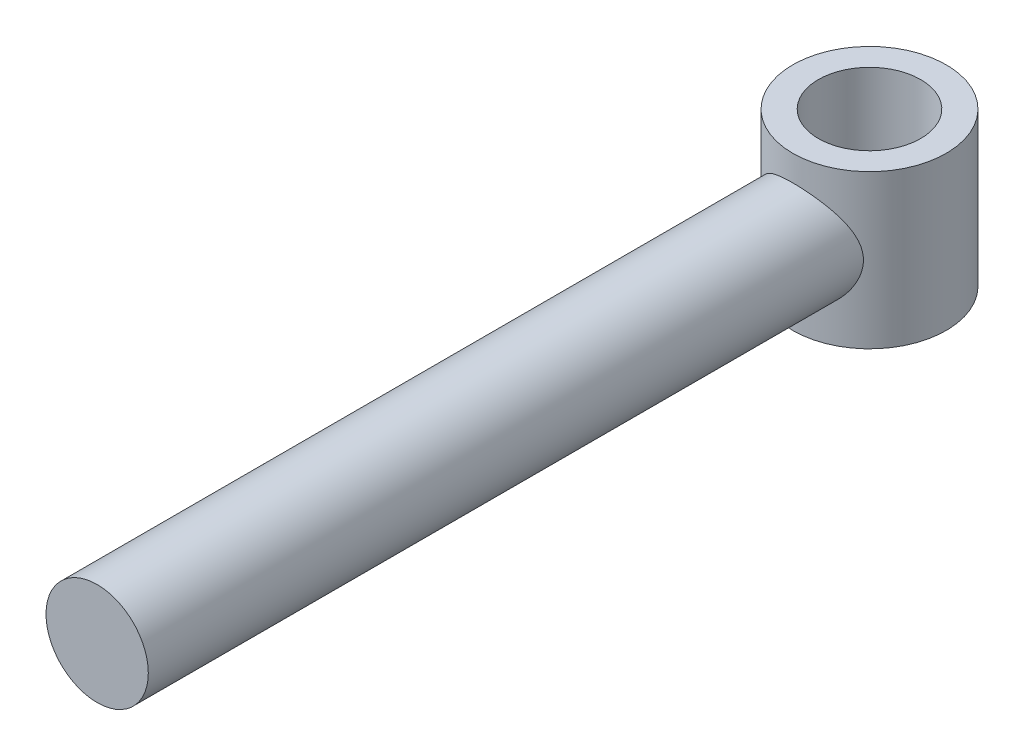
ISO-10303-21;
HEADER;
FILE_DESCRIPTION(('STEP AP214'),'2;1');
FILE_NAME('part.step','',(''),(''),'','','');
FILE_SCHEMA(('AUTOMOTIVE_DESIGN { 1 0 10303 214 1 1 1 1 }'));
ENDSEC;
DATA;
#1=APPLICATION_CONTEXT('core data for automotive mechanical design processes');
#2=APPLICATION_PROTOCOL_DEFINITION('international standard','automotive_design',2000,#1);
#3=PRODUCT_CONTEXT('',#1,'mechanical');
#4=PRODUCT('Part','Part','',(#3));
#5=PRODUCT_RELATED_PRODUCT_CATEGORY('part','',(#4));
#6=PRODUCT_DEFINITION_FORMATION('','',#4);
#7=PRODUCT_DEFINITION_CONTEXT('part definition',#1,'design');
#8=PRODUCT_DEFINITION('design','',#6,#7);
#9=PRODUCT_DEFINITION_SHAPE('','',#8);
#10=(LENGTH_UNIT() NAMED_UNIT(*) SI_UNIT(.MILLI.,.METRE.));
#11=(NAMED_UNIT(*) PLANE_ANGLE_UNIT() SI_UNIT($,.RADIAN.));
#12=(NAMED_UNIT(*) SI_UNIT($,.STERADIAN.) SOLID_ANGLE_UNIT());
#13=UNCERTAINTY_MEASURE_WITH_UNIT(LENGTH_MEASURE(1.E-05),#10,'distance_accuracy_value','');
#14=(GEOMETRIC_REPRESENTATION_CONTEXT(3) GLOBAL_UNCERTAINTY_ASSIGNED_CONTEXT((#13)) GLOBAL_UNIT_ASSIGNED_CONTEXT((#10,
#11,#12)) REPRESENTATION_CONTEXT('',''));
#15=CARTESIAN_POINT('',(0.,0.,0.));
#16=DIRECTION('',(0.,0.,1.));
#17=DIRECTION('',(1.,0.,0.));
#18=AXIS2_PLACEMENT_3D('',#15,#16,#17);
#19=CARTESIAN_POINT('',(0.,0.,177.8));
#20=DIRECTION('',(0.,0.,-1.));
#21=DIRECTION('',(-1.,0.,0.));
#22=AXIS2_PLACEMENT_3D('',#19,#20,#21);
#23=CYLINDRICAL_SURFACE('',#22,12.7);
#24=CARTESIAN_POINT('',(0.,0.,177.8));
#25=DIRECTION('',(0.,0.,1.));
#26=DIRECTION('',(1.,0.,0.));
#27=AXIS2_PLACEMENT_3D('',#24,#25,#26);
#28=CIRCLE('',#27,12.7);
#29=CARTESIAN_POINT('',(12.7,0.,177.8));
#30=VERTEX_POINT('',#29);
#31=EDGE_CURVE('E53',#30,#30,#28,.T.);
#32=ORIENTED_EDGE('',*,*,#31,.F.);
#33=EDGE_LOOP('',(#32));
#34=FACE_BOUND('',#33,.T.);
#35=CARTESIAN_POINT('',(-12.7,0.,0.229031657123601));
#36=CARTESIAN_POINT('',(-12.6999977119747,0.310012704978737,0.22903554777606));
#37=CARTESIAN_POINT('',(-12.6886249705167,0.620057438022824,0.239230920042472));
#38=CARTESIAN_POINT('',(-12.6433817788832,1.23720777302357,0.279501205289839));
#39=CARTESIAN_POINT('',(-12.609507741087,1.54431289836528,0.309579288378912));
#40=CARTESIAN_POINT('',(-12.519912147887,2.15328851686199,0.388197440830072));
#41=CARTESIAN_POINT('',(-12.4641629160762,2.45515187093428,0.43676089547101));
#42=CARTESIAN_POINT('',(-12.3317967460712,3.05124300196507,0.550222778771863));
#43=CARTESIAN_POINT('',(-12.2551691359499,3.34546678950763,0.615129559988746));
#44=CARTESIAN_POINT('',(-12.083048903963,3.92166137776216,0.758026951320603));
#45=CARTESIAN_POINT('',(-11.9877528128264,4.20372535394453,0.835880078864611));
#46=CARTESIAN_POINT('',(-11.7789380708877,4.75754712433804,1.00254171341168));
#47=CARTESIAN_POINT('',(-11.6654206910129,5.0293056357179,1.09134945623495));
#48=CARTESIAN_POINT('',(-11.2988962671107,5.82821568040227,1.37051446855346));
#49=CARTESIAN_POINT('',(-11.0198301654547,6.33928740864035,1.57368892698236));
#50=CARTESIAN_POINT('',(-10.5299962431118,7.10779816654755,1.90668152357742));
#51=CARTESIAN_POINT('',(-10.3400698069987,7.38129256412716,2.03129382602669));
#52=CARTESIAN_POINT('',(-9.93987863185937,7.91196383554938,2.28291041634368));
#53=CARTESIAN_POINT('',(-9.72961251845091,8.16913960477092,2.4099148653847));
#54=CARTESIAN_POINT('',(-9.289288728591,8.66657824457166,2.66358836378729));
#55=CARTESIAN_POINT('',(-9.05921306870562,8.90682537957079,2.79025699845735));
#56=CARTESIAN_POINT('',(-8.58003424358432,9.36930534481374,3.04054332161362));
#57=CARTESIAN_POINT('',(-8.33092976817566,9.59153693247509,3.16416079924473));
#58=CARTESIAN_POINT('',(-7.77692783087647,10.0476907760157,3.42334444597091));
#59=CARTESIAN_POINT('',(-7.46917349471749,10.2786496334743,3.55805040155415));
#60=CARTESIAN_POINT('',(-6.83073663017676,10.7135529764663,3.81657221316838));
#61=CARTESIAN_POINT('',(-6.50005134297316,10.9174942028892,3.94038675477451));
#62=CARTESIAN_POINT('',(-5.81769120391199,11.2958625620811,4.17350649806974));
#63=CARTESIAN_POINT('',(-5.46603423679166,11.4703143700988,4.28282381363));
#64=CARTESIAN_POINT('',(-4.74379195423513,11.7873606897126,4.48370761051776));
#65=CARTESIAN_POINT('',(-4.37321071422009,11.9299620251905,4.57527789354421));
#66=CARTESIAN_POINT('',(-3.65865303784004,12.1667422669219,4.72852747296075));
#67=CARTESIAN_POINT('',(-3.3163524413243,12.2645577373741,4.79240706497086));
#68=CARTESIAN_POINT('',(-2.62195737916231,12.4315244718113,4.90197185224236));
#69=CARTESIAN_POINT('',(-2.26986357588883,12.5006776693897,4.94765827482993));
#70=CARTESIAN_POINT('',(-1.55948915291248,12.609002890342,5.01941306827285));
#71=CARTESIAN_POINT('',(-1.2012154128157,12.6482062973116,5.0455019743679));
#72=CARTESIAN_POINT('',(-0.481748521364579,12.6959771066052,5.07730969810913));
#73=CARTESIAN_POINT('',(-0.120555789135986,12.7045488315364,5.08303138988592));
#74=CARTESIAN_POINT('',(0.545977074000862,12.6919472076019,5.07463259789147));
#75=CARTESIAN_POINT('',(0.85144757538674,12.6751042129758,5.06340069622206));
#76=CARTESIAN_POINT('',(1.45947735526262,12.6195518624076,5.02645107805321));
#77=CARTESIAN_POINT('',(1.76203700441655,12.5808453290467,5.00073523143134));
#78=CARTESIAN_POINT('',(2.36212562431451,12.4821010784272,4.93539554550888));
#79=CARTESIAN_POINT('',(2.65965437619799,12.42206243564,4.89577110276199));
#80=CARTESIAN_POINT('',(3.2477434731375,12.281432269573,4.80347238924742));
#81=CARTESIAN_POINT('',(3.53830351644082,12.200839858044,4.75079755449845));
#82=CARTESIAN_POINT('',(4.10953190541883,12.0204444785481,4.6337334513632));
#83=CARTESIAN_POINT('',(4.39023727015804,11.920725222046,4.56939529420503));
#84=CARTESIAN_POINT('',(4.94178334563123,11.7028517985634,4.43006045772515));
#85=CARTESIAN_POINT('',(5.21262004067534,11.5846902282493,4.35505949909666));
#86=CARTESIAN_POINT('',(5.74314173477802,11.3310529177882,4.19577885725519));
#87=CARTESIAN_POINT('',(6.00282878078201,11.1955803740496,4.11150088740578));
#88=CARTESIAN_POINT('',(6.51024515533807,10.908332869392,3.93506578231165));
#89=CARTESIAN_POINT('',(6.75797307548681,10.7565559950988,3.84290772256836));
#90=CARTESIAN_POINT('',(7.27248710951176,10.4167203555039,3.63964648159054));
#91=CARTESIAN_POINT('',(7.53750156276716,10.2265146173388,3.52764495383651));
#92=CARTESIAN_POINT('',(8.05053952465949,9.82773618044362,3.29761033157287));
#93=CARTESIAN_POINT('',(8.29856176703086,9.61916211554057,3.1795767886972));
#94=CARTESIAN_POINT('',(8.77732290554606,9.18440570712839,2.93955066303762));
#95=CARTESIAN_POINT('',(9.00803680171706,8.95819882063012,2.81755270498106));
#96=CARTESIAN_POINT('',(9.451233824735,8.48930323388696,2.57209367691352));
#97=CARTESIAN_POINT('',(9.66371545060214,8.24661317959879,2.44863248739179));
#98=CARTESIAN_POINT('',(10.1014214617723,7.7065017902318,2.18360590999463));
#99=CARTESIAN_POINT('',(10.3234961380071,7.40643546299729,2.04220811219275));
#100=CARTESIAN_POINT('',(10.741465175483,6.78607681880215,1.76487687037188));
#101=CARTESIAN_POINT('',(10.9373536462383,6.46577997484467,1.62894466060803));
#102=CARTESIAN_POINT('',(11.3012099185556,5.80639550131142,1.36738173239818));
#103=CARTESIAN_POINT('',(11.4692215013225,5.46733847361716,1.24173502068927));
#104=CARTESIAN_POINT('',(11.7759209042205,4.77098924818188,1.0055695053963));
#105=CARTESIAN_POINT('',(11.9146075155383,4.41369629948584,0.895051325496163));
#106=CARTESIAN_POINT('',(12.125337008358,3.78710470148277,0.723248742267917));
#107=CARTESIAN_POINT('',(12.2051062844318,3.52176972555369,0.656912044136649));
#108=CARTESIAN_POINT('',(12.3476139793357,2.98391453695631,0.536812874768645));
#109=CARTESIAN_POINT('',(12.4103632760973,2.71139903634657,0.483042375188796));
#110=CARTESIAN_POINT('',(12.5179737523736,2.16076815510134,0.38994103435114));
#111=CARTESIAN_POINT('',(12.5628572262605,1.88266021155425,0.350592201500896));
#112=CARTESIAN_POINT('',(12.6341332919858,1.32228422222191,0.287750452548324));
#113=CARTESIAN_POINT('',(12.6605258090948,1.04001615962864,0.264257600526421));
#114=CARTESIAN_POINT('',(12.6944193254624,0.472187106069349,0.234039769777274));
#115=CARTESIAN_POINT('',(12.7018365020652,0.186617082960048,0.227389192290143));
#116=CARTESIAN_POINT('',(12.6973946024109,-0.38425134471535,0.231361825244995));
#117=CARTESIAN_POINT('',(12.6855354799346,-0.669549748628539,0.241985077104839));
#118=CARTESIAN_POINT('',(12.6427517573922,-1.23776922840445,0.280057463943202));
#119=CARTESIAN_POINT('',(12.6118135703742,-1.52068846429843,0.30751858975382));
#120=CARTESIAN_POINT('',(12.5314071909787,-2.08187308918654,0.378142097291157));
#121=CARTESIAN_POINT('',(12.4819386888478,-2.36013840030428,0.421304741484635));
#122=CARTESIAN_POINT('',(12.3681210318632,-2.89673533589147,0.519217214069028));
#123=CARTESIAN_POINT('',(12.3046250904215,-3.15537361110933,0.573291397445337));
#124=CARTESIAN_POINT('',(12.1623081382344,-3.66585636575453,0.692515874250366));
#125=CARTESIAN_POINT('',(12.0834821778633,-3.91769862095456,0.757669744138166));
#126=CARTESIAN_POINT('',(11.9112700126114,-4.41367985549843,0.897293802342331));
#127=CARTESIAN_POINT('',(11.8178836560521,-4.657818754563,0.971764087708078));
#128=CARTESIAN_POINT('',(11.6172526121013,-5.13781231719623,1.12828231863468));
#129=CARTESIAN_POINT('',(11.5100073694547,-5.37366664836262,1.21033056776838));
#130=CARTESIAN_POINT('',(11.2594899849706,-5.88300490956475,1.39735007958926));
#131=CARTESIAN_POINT('',(11.1133024472384,-6.15457914845637,1.50362376412137));
#132=CARTESIAN_POINT('',(10.8027872808332,-6.68461907532249,1.72198245541233));
#133=CARTESIAN_POINT('',(10.6384614896169,-6.94308608723212,1.83406687291842));
#134=CARTESIAN_POINT('',(10.2921683337638,-7.44679700163212,2.06174213589708));
#135=CARTESIAN_POINT('',(10.1101803854789,-7.69202494465302,2.17733696202373));
#136=CARTESIAN_POINT('',(9.72931613350423,-8.16844093358034,2.4096422687146));
#137=CARTESIAN_POINT('',(9.53043869775697,-8.39962803658233,2.52635282359714));
#138=CARTESIAN_POINT('',(9.07098830166778,-8.89636455614034,2.78420503467496));
#139=CARTESIAN_POINT('',(8.8064339702319,-9.15837353074346,2.92510839133525));
#140=CARTESIAN_POINT('',(8.25381279938453,-9.65938351310245,3.20185478664941));
#141=CARTESIAN_POINT('',(7.96574165132104,-9.89838028709913,3.33769689133217));
#142=CARTESIAN_POINT('',(7.36730077482963,-10.3515039111279,3.60077512239473));
#143=CARTESIAN_POINT('',(7.05694664826808,-10.5656478927036,3.7280171514121));
#144=CARTESIAN_POINT('',(6.41507721674435,-10.9672240249653,3.97064967299125));
#145=CARTESIAN_POINT('',(6.08356762061476,-11.1546633381785,4.08604334110414));
#146=CARTESIAN_POINT('',(5.46669676297043,-11.4673785745003,4.28106469592121));
#147=CARTESIAN_POINT('',(5.18469943532756,-11.597679664671,4.36330519496278));
#148=CARTESIAN_POINT('',(4.60927210438543,-11.8381502010247,4.51636511177915));
#149=CARTESIAN_POINT('',(4.3158442410609,-11.9483233936975,4.58718665472323));
#150=CARTESIAN_POINT('',(3.71925383964937,-12.1472612410577,4.71589590980046));
#151=CARTESIAN_POINT('',(3.41609761634831,-12.2360394771996,4.77379182535592));
#152=CARTESIAN_POINT('',(2.80174292673661,-12.3911499479169,4.87541485662457));
#153=CARTESIAN_POINT('',(2.49054434382675,-12.4574818568657,4.91914176678902));
#154=CARTESIAN_POINT('',(1.8608936687482,-12.5670059340202,4.99155161041684));
#155=CARTESIAN_POINT('',(1.54241520617452,-12.6100924627792,5.02016585164927));
#156=CARTESIAN_POINT('',(0.902067548621482,-12.6720060272893,5.06133469819177));
#157=CARTESIAN_POINT('',(0.580198348274773,-12.6908330246331,5.07388927807645));
#158=CARTESIAN_POINT('',(-0.0642425642359378,-12.7039260730717,5.08261698736018));
#159=CARTESIAN_POINT('',(-0.386814233404727,-12.6981935873412,5.078791092655));
#160=CARTESIAN_POINT('',(-1.02996992718405,-12.6622622966344,5.05485757204767));
#161=CARTESIAN_POINT('',(-1.35055404158346,-12.6320646051231,5.03475068712903));
#162=CARTESIAN_POINT('',(-1.96392784282131,-12.5507619354675,4.9808120892955));
#163=CARTESIAN_POINT('',(-2.25704095456274,-12.5013403427321,4.94808695739198));
#164=CARTESIAN_POINT('',(-2.83741433056514,-12.382520397682,4.86978010827257));
#165=CARTESIAN_POINT('',(-3.12467493400179,-12.3131232065778,4.82419913838824));
#166=CARTESIAN_POINT('',(-3.69168495361534,-12.1551672505527,4.72109448318452));
#167=CARTESIAN_POINT('',(-3.97143389601385,-12.0666072801659,4.66357004655102));
#168=CARTESIAN_POINT('',(-4.52197844704448,-11.8712695423986,4.53767315790456));
#169=CARTESIAN_POINT('',(-4.79277358227901,-11.7644908136051,4.46930013341956));
#170=CARTESIAN_POINT('',(-5.33958025126296,-11.5270459811257,4.31869544621017));
#171=CARTESIAN_POINT('',(-5.61498894523602,-11.3953560663641,4.23589125415809));
#172=CARTESIAN_POINT('',(-6.15333506036213,-11.1138986991832,4.06105881204224));
#173=CARTESIAN_POINT('',(-6.41627212819639,-10.9641307350417,3.96903030088493));
#174=CARTESIAN_POINT('',(-6.92892031909448,-10.6475753190127,3.77732337350415));
#175=CARTESIAN_POINT('',(-7.1786257332329,-10.4807806101502,3.6776416999484));
#176=CARTESIAN_POINT('',(-7.66403923380802,-10.1312376481454,3.47231835531777));
#177=CARTESIAN_POINT('',(-7.89974574554408,-9.94848760591801,3.36667601633948));
#178=CARTESIAN_POINT('',(-8.39260859135741,-9.53795343051661,3.13415392942038));
#179=CARTESIAN_POINT('',(-8.64729551520523,-9.3076099522901,3.00655005375048));
#180=CARTESIAN_POINT('',(-9.13638558640354,-8.82800932240796,2.74841524490935));
#181=CARTESIAN_POINT('',(-9.37079441446595,-8.57875750470488,2.61788514447797));
#182=CARTESIAN_POINT('',(-9.81895297420551,-8.06196349129393,2.35660399338796));
#183=CARTESIAN_POINT('',(-10.0326831719889,-7.79440440124473,2.22585285026752));
#184=CARTESIAN_POINT('',(-10.4384531027142,-7.24197081436507,1.96734773149892));
#185=CARTESIAN_POINT('',(-10.630494936291,-6.95709799858029,1.83959346653818));
#186=CARTESIAN_POINT('',(-10.9781578665313,-6.39306362886855,1.59996043130312));
#187=CARTESIAN_POINT('',(-11.1354398834009,-6.11512488489455,1.48761411974233));
#188=CARTESIAN_POINT('',(-11.4297672616963,-5.54555376167505,1.27126902779553));
#189=CARTESIAN_POINT('',(-11.5668120141246,-5.25392097068431,1.16727049866122));
#190=CARTESIAN_POINT('',(-11.8192875014913,-4.65821047154894,0.970966641692223));
#191=CARTESIAN_POINT('',(-11.9347526554442,-4.35415354028934,0.878642770424774));
#192=CARTESIAN_POINT('',(-12.1429630764628,-3.73433242284358,0.708863137164288));
#193=CARTESIAN_POINT('',(-12.2357145302937,-3.41857145164775,0.631403327739888));
#194=CARTESIAN_POINT('',(-12.3791734354968,-2.84821807758176,0.509825036790826));
#195=CARTESIAN_POINT('',(-12.4346431735284,-2.59558008093628,0.462121944925741));
#196=CARTESIAN_POINT('',(-12.5302951569388,-2.08542987079258,0.379154159200479));
#197=CARTESIAN_POINT('',(-12.5704803951779,-1.82791862190408,0.343887030351005));
#198=CARTESIAN_POINT('',(-12.6349960069851,-1.30958984600524,0.286971537846031));
#199=CARTESIAN_POINT('',(-12.6593372052263,-1.0487747006771,0.265313876531559));
#200=CARTESIAN_POINT('',(-12.6918411539603,-0.525314180098824,0.236341416524769));
#201=CARTESIAN_POINT('',(-12.7000019386056,-0.262668586347042,0.229028360638764));
#202=CARTESIAN_POINT('',(-12.7,0.,0.229031657123601));
#203=B_SPLINE_CURVE_WITH_KNOTS('',3,(#35,#36,#37,#38,#39,#40,#41,#42,#43,#44,#45,#46,#47,#48,
#49,#50,#51,#52,#53,#54,#55,#56,#57,#58,#59,#60,#61,#62,#63,#64,#65,#66,#67,#68,#69,#70,#71,#72,
#73,#74,#75,#76,#77,#78,#79,#80,#81,#82,#83,#84,#85,#86,#87,#88,#89,#90,#91,#92,#93,#94,#95,#96,
#97,#98,#99,#100,#101,#102,#103,#104,#105,#106,#107,#108,#109,#110,#111,#112,#113,#114,#115,
#116,#117,#118,#119,#120,#121,#122,#123,#124,#125,#126,#127,#128,#129,#130,#131,#132,#133,#134,
#135,#136,#137,#138,#139,#140,#141,#142,#143,#144,#145,#146,#147,#148,#149,#150,#151,#152,#153,
#154,#155,#156,#157,#158,#159,#160,#161,#162,#163,#164,#165,#166,#167,#168,#169,#170,#171,#172,
#173,#174,#175,#176,#177,#178,#179,#180,#181,#182,#183,#184,#185,#186,#187,#188,#189,#190,#191,
#192,#193,#194,#195,#196,#197,#198,#199,#200,#201,#202),.UNSPECIFIED.,.T.,.F.,(4,2,2,2,2,2,2,2,
2,2,2,2,2,2,2,2,2,2,2,2,2,2,2,2,2,2,2,2,2,2,2,2,2,2,2,2,2,2,2,2,2,2,2,2,2,2,2,2,2,2,2,2,2,2,2,2,
2,2,2,2,2,2,2,2,2,2,2,2,2,2,2,2,2,2,2,2,2,2,2,2,2,2,2,4),(0.,0.929724985033373,1.85959824159105,
2.79065178319565,3.72218212602978,4.64438721688073,5.56652801224053,7.40989441344305,
8.47573452469243,9.54164670671941,10.6085369553517,11.6755007278773,12.896893347469,
14.1184331685655,15.338945752574,16.5591965935276,17.6426278819671,18.7259860688539,
19.8082074702286,20.8902761472809,21.8075855174087,22.7247764900156,23.6420072613144,
24.5592776782625,25.4726215344035,26.3863329834432,27.2998759621117,28.2135262658309,
29.2472033664089,30.2809574133711,31.316176949052,32.3514816280397,33.5476470315829,
34.7440810567517,35.9386178986541,37.1332039713215,37.9871169758521,38.8404829284426,
39.6927806204306,40.5450817568774,41.4011414423011,42.2572031803221,43.1138752586861,
43.9705616578484,44.7850409725959,45.5997836973728,46.4145349100561,47.2293187758013,
48.2070800675588,49.1847424000557,50.1635581133743,51.1424394859756,52.3353710153325,
53.5285216012247,54.7208447763315,55.9128475509179,56.8759322718262,57.8388375466958,
58.8011299525178,59.7634363176215,60.7300798474467,61.6967249076442,62.6633123790515,
63.6298558614192,64.525985630228,65.4220633162338,66.3181973878691,67.2143787635794,
68.1623478921283,69.110343860442,70.0587455749196,71.0072537714002,72.1051657078547,
73.2027690721234,74.3013993569078,75.3999231420025,76.4146255474232,77.4293584819307,
78.4424588619745,79.4552829857038,80.2436212449892,81.0318050600614,81.8194498199269,
82.607190269232),.UNSPECIFIED.);
#204=CARTESIAN_POINT('',(-12.7,0.,0.229031657123601));
#205=VERTEX_POINT('',#204);
#206=EDGE_CURVE('E10',#205,#205,#203,.T.);
#207=ORIENTED_EDGE('',*,*,#206,.F.);
#208=EDGE_LOOP('',(#207));
#209=FACE_BOUND('',#208,.T.);
#210=ADVANCED_FACE('F41',(#34,#209),#23,.T.);
#211=CARTESIAN_POINT('',(0.,0.,177.8));
#212=DIRECTION('',(0.,0.,1.));
#213=DIRECTION('',(1.,0.,0.));
#214=AXIS2_PLACEMENT_3D('',#211,#212,#213);
#215=PLANE('',#214);
#216=ORIENTED_EDGE('',*,*,#31,.T.);
#217=EDGE_LOOP('',(#216));
#218=FACE_BOUND('',#217,.T.);
#219=ADVANCED_FACE('F93',(#218),#215,.T.);
#220=CARTESIAN_POINT('',(0.,19.05,-13.97));
#221=DIRECTION('',(0.,-1.,0.));
#222=DIRECTION('',(0.,0.,-1.));
#223=AXIS2_PLACEMENT_3D('',#220,#221,#222);
#224=CYLINDRICAL_SURFACE('',#223,19.05);
#225=CARTESIAN_POINT('',(0.,-19.05,-13.97));
#226=DIRECTION('',(0.,1.,0.));
#227=DIRECTION('',(0.,0.,1.));
#228=AXIS2_PLACEMENT_3D('',#225,#226,#227);
#229=CIRCLE('',#228,19.05);
#230=CARTESIAN_POINT('',(0.,-19.05,5.08));
#231=VERTEX_POINT('',#230);
#232=EDGE_CURVE('E63',#231,#231,#229,.T.);
#233=ORIENTED_EDGE('',*,*,#232,.T.);
#234=EDGE_LOOP('',(#233));
#235=FACE_BOUND('',#234,.T.);
#236=CARTESIAN_POINT('',(0.,19.05,-13.97));
#237=DIRECTION('',(0.,1.,0.));
#238=DIRECTION('',(0.,0.,1.));
#239=AXIS2_PLACEMENT_3D('',#236,#237,#238);
#240=CIRCLE('',#239,19.05);
#241=CARTESIAN_POINT('',(0.,19.05,5.08));
#242=VERTEX_POINT('',#241);
#243=EDGE_CURVE('E58',#242,#242,#240,.T.);
#244=ORIENTED_EDGE('',*,*,#243,.F.);
#245=EDGE_LOOP('',(#244));
#246=FACE_BOUND('',#245,.T.);
#247=ORIENTED_EDGE('',*,*,#206,.T.);
#248=EDGE_LOOP('',(#247));
#249=FACE_BOUND('',#248,.T.);
#250=ADVANCED_FACE('F84',(#235,#246,#249),#224,.T.);
#251=CARTESIAN_POINT('',(0.,19.05,-13.97));
#252=DIRECTION('',(0.,1.,0.));
#253=DIRECTION('',(0.,0.,1.));
#254=AXIS2_PLACEMENT_3D('',#251,#252,#253);
#255=PLANE('',#254);
#256=ORIENTED_EDGE('',*,*,#243,.T.);
#257=EDGE_LOOP('',(#256));
#258=FACE_BOUND('',#257,.T.);
#259=CARTESIAN_POINT('',(0.,19.05,-13.97));
#260=DIRECTION('',(0.,1.,0.));
#261=DIRECTION('',(0.,0.,1.));
#262=AXIS2_PLACEMENT_3D('',#259,#260,#261);
#263=CIRCLE('',#262,12.7);
#264=CARTESIAN_POINT('',(0.,19.05,-26.67));
#265=VERTEX_POINT('',#264);
#266=EDGE_CURVE('E68',#265,#265,#263,.T.);
#267=ORIENTED_EDGE('',*,*,#266,.F.);
#268=EDGE_LOOP('',(#267));
#269=FACE_BOUND('',#268,.T.);
#270=ADVANCED_FACE('F81',(#258,#269),#255,.T.);
#271=CARTESIAN_POINT('',(0.,-19.05,-13.97));
#272=DIRECTION('',(0.,1.,0.));
#273=DIRECTION('',(0.,0.,1.));
#274=AXIS2_PLACEMENT_3D('',#271,#272,#273);
#275=PLANE('',#274);
#276=ORIENTED_EDGE('',*,*,#232,.F.);
#277=EDGE_LOOP('',(#276));
#278=FACE_BOUND('',#277,.T.);
#279=CARTESIAN_POINT('',(0.,-19.05,-13.97));
#280=DIRECTION('',(0.,1.,0.));
#281=DIRECTION('',(0.,0.,1.));
#282=AXIS2_PLACEMENT_3D('',#279,#280,#281);
#283=CIRCLE('',#282,12.7);
#284=CARTESIAN_POINT('',(0.,-19.05,-26.67));
#285=VERTEX_POINT('',#284);
#286=EDGE_CURVE('E70',#285,#285,#283,.T.);
#287=ORIENTED_EDGE('',*,*,#286,.T.);
#288=EDGE_LOOP('',(#287));
#289=FACE_BOUND('',#288,.T.);
#290=ADVANCED_FACE('F83',(#278,#289),#275,.F.);
#291=CARTESIAN_POINT('',(0.,19.05,-13.97));
#292=DIRECTION('',(0.,-1.,0.));
#293=DIRECTION('',(0.,0.,-1.));
#294=AXIS2_PLACEMENT_3D('',#291,#292,#293);
#295=CYLINDRICAL_SURFACE('',#294,12.7);
#296=CARTESIAN_POINT('',(0.,19.05,-26.67));
#297=CARTESIAN_POINT('',(0.,18.653125,-26.67));
#298=CARTESIAN_POINT('',(0.,18.25625,-26.67));
#299=CARTESIAN_POINT('',(0.,17.4625,-26.67));
#300=CARTESIAN_POINT('',(0.,17.065625,-26.67));
#301=CARTESIAN_POINT('',(0.,16.271875,-26.67));
#302=CARTESIAN_POINT('',(0.,15.875,-26.67));
#303=CARTESIAN_POINT('',(0.,15.08125,-26.67));
#304=CARTESIAN_POINT('',(0.,14.684375,-26.67));
#305=CARTESIAN_POINT('',(0.,13.890625,-26.67));
#306=CARTESIAN_POINT('',(0.,13.49375,-26.67));
#307=CARTESIAN_POINT('',(0.,12.7,-26.67));
#308=CARTESIAN_POINT('',(0.,12.303125,-26.67));
#309=CARTESIAN_POINT('',(0.,11.509375,-26.67));
#310=CARTESIAN_POINT('',(0.,11.1125,-26.67));
#311=CARTESIAN_POINT('',(0.,10.31875,-26.67));
#312=CARTESIAN_POINT('',(0.,9.921875,-26.67));
#313=CARTESIAN_POINT('',(0.,9.128125,-26.67));
#314=CARTESIAN_POINT('',(0.,8.73125,-26.67));
#315=CARTESIAN_POINT('',(0.,7.9375,-26.67));
#316=CARTESIAN_POINT('',(0.,7.540625,-26.67));
#317=CARTESIAN_POINT('',(0.,6.746875,-26.67));
#318=CARTESIAN_POINT('',(0.,6.35,-26.67));
#319=CARTESIAN_POINT('',(0.,5.55625,-26.67));
#320=CARTESIAN_POINT('',(0.,5.159375,-26.67));
#321=CARTESIAN_POINT('',(0.,4.365625,-26.67));
#322=CARTESIAN_POINT('',(0.,3.96875,-26.67));
#323=CARTESIAN_POINT('',(0.,3.175,-26.67));
#324=CARTESIAN_POINT('',(0.,2.778125,-26.67));
#325=CARTESIAN_POINT('',(0.,1.984375,-26.67));
#326=CARTESIAN_POINT('',(0.,1.5875,-26.67));
#327=CARTESIAN_POINT('',(0.,0.79375,-26.67));
#328=CARTESIAN_POINT('',(0.,0.396875,-26.67));
#329=CARTESIAN_POINT('',(0.,-0.396875,-26.67));
#330=CARTESIAN_POINT('',(0.,-0.79375,-26.67));
#331=CARTESIAN_POINT('',(0.,-1.5875,-26.67));
#332=CARTESIAN_POINT('',(0.,-1.984375,-26.67));
#333=CARTESIAN_POINT('',(0.,-2.778125,-26.67));
#334=CARTESIAN_POINT('',(0.,-3.175,-26.67));
#335=CARTESIAN_POINT('',(0.,-3.96875,-26.67));
#336=CARTESIAN_POINT('',(0.,-4.365625,-26.67));
#337=CARTESIAN_POINT('',(0.,-5.159375,-26.67));
#338=CARTESIAN_POINT('',(0.,-5.55625,-26.67));
#339=CARTESIAN_POINT('',(0.,-6.35,-26.67));
#340=CARTESIAN_POINT('',(0.,-6.746875,-26.67));
#341=CARTESIAN_POINT('',(0.,-7.540625,-26.67));
#342=CARTESIAN_POINT('',(0.,-7.9375,-26.67));
#343=CARTESIAN_POINT('',(0.,-8.73125,-26.67));
#344=CARTESIAN_POINT('',(0.,-9.128125,-26.67));
#345=CARTESIAN_POINT('',(0.,-9.921875,-26.67));
#346=CARTESIAN_POINT('',(0.,-10.31875,-26.67));
#347=CARTESIAN_POINT('',(0.,-11.1125,-26.67));
#348=CARTESIAN_POINT('',(0.,-11.509375,-26.67));
#349=CARTESIAN_POINT('',(0.,-12.303125,-26.67));
#350=CARTESIAN_POINT('',(0.,-12.7,-26.67));
#351=CARTESIAN_POINT('',(0.,-13.49375,-26.67));
#352=CARTESIAN_POINT('',(0.,-13.890625,-26.67));
#353=CARTESIAN_POINT('',(0.,-14.684375,-26.67));
#354=CARTESIAN_POINT('',(0.,-15.08125,-26.67));
#355=CARTESIAN_POINT('',(0.,-15.875,-26.67));
#356=CARTESIAN_POINT('',(0.,-16.271875,-26.67));
#357=CARTESIAN_POINT('',(0.,-17.065625,-26.67));
#358=CARTESIAN_POINT('',(0.,-17.4625,-26.67));
#359=CARTESIAN_POINT('',(0.,-18.25625,-26.67));
#360=CARTESIAN_POINT('',(0.,-18.653125,-26.67));
#361=CARTESIAN_POINT('',(0.,-19.05,-26.67));
#362=B_SPLINE_CURVE_WITH_KNOTS('',3,(#296,#297,#298,#299,#300,#301,#302,#303,#304,#305,#306,
#307,#308,#309,#310,#311,#312,#313,#314,#315,#316,#317,#318,#319,#320,#321,#322,#323,#324,#325,
#326,#327,#328,#329,#330,#331,#332,#333,#334,#335,#336,#337,#338,#339,#340,#341,#342,#343,#344,
#345,#346,#347,#348,#349,#350,#351,#352,#353,#354,#355,#356,#357,#358,#359,#360,#361),
.UNSPECIFIED.,.F.,.F.,(4,2,2,2,2,2,2,2,2,2,2,2,2,2,2,2,2,2,2,2,2,2,2,2,2,2,2,2,2,2,2,2,4),(0.,
1.190625,2.38125,3.571875,4.7625,5.953125,7.14375,8.334375,9.525,10.715625,11.90625,13.096875,
14.2875,15.478125,16.66875,17.859375,19.05,20.240625,21.43125,22.621875,23.8125,25.003125,
26.19375,27.384375,28.575,29.765625,30.95625,32.146875,33.3375,34.528125,35.71875,36.909375,
38.1),.UNSPECIFIED.);
#363=EDGE_CURVE('BSEAM78',#265,#285,#362,.T.);
#364=ORIENTED_EDGE('',*,*,#266,.T.);
#365=ORIENTED_EDGE('',*,*,#286,.F.);
#366=ORIENTED_EDGE('',*,*,#363,.T.);
#367=ORIENTED_EDGE('',*,*,#363,.F.);
#368=EDGE_LOOP('',(#364,#366,#365,#367));
#369=FACE_BOUND('',#368,.T.);
#370=ADVANCED_FACE('F78',(#369),#295,.F.);
#371=CLOSED_SHELL('',(#210,#219,#250,#270,#290,#370));
#372=MANIFOLD_SOLID_BREP('B2',#371);
#373=ADVANCED_BREP_SHAPE_REPRESENTATION('',(#18,#372),#14);
#374=SHAPE_DEFINITION_REPRESENTATION(#9,#373);
ENDSEC;
END-ISO-10303-21;
